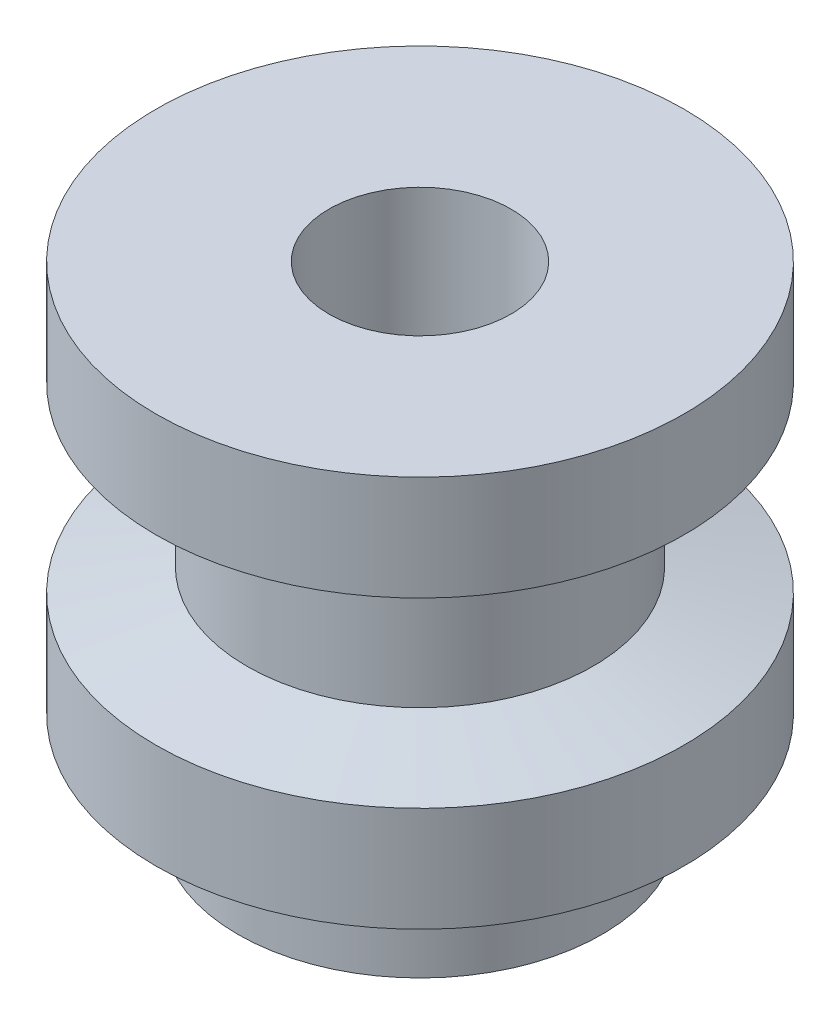
ISO-10303-21;
HEADER;
FILE_DESCRIPTION(('STEP AP214'),'2;1');
FILE_NAME('part.step','',(''),(''),'','','');
FILE_SCHEMA(('AUTOMOTIVE_DESIGN { 1 0 10303 214 1 1 1 1 }'));
ENDSEC;
DATA;
#1=APPLICATION_CONTEXT('core data for automotive mechanical design processes');
#2=APPLICATION_PROTOCOL_DEFINITION('international standard','automotive_design',2000,#1);
#3=PRODUCT_CONTEXT('',#1,'mechanical');
#4=PRODUCT('Part','Part','',(#3));
#5=PRODUCT_RELATED_PRODUCT_CATEGORY('part','',(#4));
#6=PRODUCT_DEFINITION_FORMATION('','',#4);
#7=PRODUCT_DEFINITION_CONTEXT('part definition',#1,'design');
#8=PRODUCT_DEFINITION('design','',#6,#7);
#9=PRODUCT_DEFINITION_SHAPE('','',#8);
#10=(LENGTH_UNIT() NAMED_UNIT(*) SI_UNIT(.MILLI.,.METRE.));
#11=(NAMED_UNIT(*) PLANE_ANGLE_UNIT() SI_UNIT($,.RADIAN.));
#12=(NAMED_UNIT(*) SI_UNIT($,.STERADIAN.) SOLID_ANGLE_UNIT());
#13=UNCERTAINTY_MEASURE_WITH_UNIT(LENGTH_MEASURE(1.E-05),#10,'distance_accuracy_value','');
#14=(GEOMETRIC_REPRESENTATION_CONTEXT(3) GLOBAL_UNCERTAINTY_ASSIGNED_CONTEXT((#13)) GLOBAL_UNIT_ASSIGNED_CONTEXT((#10,
#11,#12)) REPRESENTATION_CONTEXT('',''));
#15=CARTESIAN_POINT('',(0.,0.,0.));
#16=DIRECTION('',(0.,0.,1.));
#17=DIRECTION('',(1.,0.,0.));
#18=AXIS2_PLACEMENT_3D('',#15,#16,#17);
#19=CARTESIAN_POINT('',(0.,0.,-2.));
#20=DIRECTION('',(0.,1.,0.));
#21=DIRECTION('',(0.,0.,-1.));
#22=AXIS2_PLACEMENT_3D('',#19,#20,#21);
#23=PLANE('',#22);
#24=CARTESIAN_POINT('',(0.,0.,0.));
#25=DIRECTION('',(0.,1.,0.));
#26=DIRECTION('',(0.,0.,1.));
#27=AXIS2_PLACEMENT_3D('',#24,#25,#26);
#28=CIRCLE('',#27,1.);
#29=CARTESIAN_POINT('',(0.,0.,1.));
#30=VERTEX_POINT('',#29);
#31=EDGE_CURVE('E10',#30,#30,#28,.T.);
#32=ORIENTED_EDGE('',*,*,#31,.T.);
#33=EDGE_LOOP('',(#32));
#34=FACE_BOUND('',#33,.T.);
#35=CARTESIAN_POINT('',(0.,0.,0.));
#36=DIRECTION('',(0.,1.,0.));
#37=DIRECTION('',(0.,0.,1.));
#38=AXIS2_PLACEMENT_3D('',#35,#36,#37);
#39=CIRCLE('',#38,2.);
#40=CARTESIAN_POINT('',(0.,0.,2.));
#41=VERTEX_POINT('',#40);
#42=EDGE_CURVE('E67',#41,#41,#39,.T.);
#43=ORIENTED_EDGE('',*,*,#42,.F.);
#44=EDGE_LOOP('',(#43));
#45=FACE_BOUND('',#44,.T.);
#46=ADVANCED_FACE('F33',(#34,#45),#23,.F.);
#47=CARTESIAN_POINT('',(0.,0.,0.));
#48=DIRECTION('',(0.,-1.,0.));
#49=DIRECTION('',(0.,0.,1.));
#50=AXIS2_PLACEMENT_3D('',#47,#48,#49);
#51=CYLINDRICAL_SURFACE('',#50,1.);
#52=CARTESIAN_POINT('',(0.,5.4,0.));
#53=DIRECTION('',(0.,1.,0.));
#54=DIRECTION('',(0.,0.,1.));
#55=AXIS2_PLACEMENT_3D('',#52,#53,#54);
#56=CIRCLE('',#55,1.);
#57=CARTESIAN_POINT('',(0.,5.4,1.));
#58=VERTEX_POINT('',#57);
#59=EDGE_CURVE('E39',#58,#58,#56,.T.);
#60=ORIENTED_EDGE('',*,*,#59,.T.);
#61=EDGE_LOOP('',(#60));
#62=FACE_BOUND('',#61,.T.);
#63=ORIENTED_EDGE('',*,*,#31,.F.);
#64=EDGE_LOOP('',(#63));
#65=FACE_BOUND('',#64,.T.);
#66=ADVANCED_FACE('F75',(#62,#65),#51,.F.);
#67=CARTESIAN_POINT('',(0.,5.4,-1.));
#68=DIRECTION('',(0.,-1.,0.));
#69=DIRECTION('',(0.,0.,1.));
#70=AXIS2_PLACEMENT_3D('',#67,#68,#69);
#71=PLANE('',#70);
#72=CARTESIAN_POINT('',(0.,5.4,0.));
#73=DIRECTION('',(0.,1.,0.));
#74=DIRECTION('',(0.,0.,1.));
#75=AXIS2_PLACEMENT_3D('',#72,#73,#74);
#76=CIRCLE('',#75,2.9);
#77=CARTESIAN_POINT('',(0.,5.4,2.9));
#78=VERTEX_POINT('',#77);
#79=EDGE_CURVE('E43',#78,#78,#76,.T.);
#80=ORIENTED_EDGE('',*,*,#79,.T.);
#81=EDGE_LOOP('',(#80));
#82=FACE_BOUND('',#81,.T.);
#83=ORIENTED_EDGE('',*,*,#59,.F.);
#84=EDGE_LOOP('',(#83));
#85=FACE_BOUND('',#84,.T.);
#86=ADVANCED_FACE('F79',(#82,#85),#71,.F.);
#87=CARTESIAN_POINT('',(0.,0.,0.));
#88=DIRECTION('',(0.,-1.,0.));
#89=DIRECTION('',(0.,0.,1.));
#90=AXIS2_PLACEMENT_3D('',#87,#88,#89);
#91=CYLINDRICAL_SURFACE('',#90,2.9);
#92=CARTESIAN_POINT('',(0.,4.25,0.));
#93=DIRECTION('',(0.,1.,0.));
#94=DIRECTION('',(0.,0.,1.));
#95=AXIS2_PLACEMENT_3D('',#92,#93,#94);
#96=CIRCLE('',#95,2.9);
#97=CARTESIAN_POINT('',(0.,4.25,2.9));
#98=VERTEX_POINT('',#97);
#99=EDGE_CURVE('E47',#98,#98,#96,.T.);
#100=ORIENTED_EDGE('',*,*,#99,.T.);
#101=EDGE_LOOP('',(#100));
#102=FACE_BOUND('',#101,.T.);
#103=ORIENTED_EDGE('',*,*,#79,.F.);
#104=EDGE_LOOP('',(#103));
#105=FACE_BOUND('',#104,.T.);
#106=ADVANCED_FACE('F83',(#102,#105),#91,.T.);
#107=CARTESIAN_POINT('',(0.,4.25,0.));
#108=DIRECTION('',(0.,1.,0.));
#109=DIRECTION('',(0.,0.,-1.));
#110=AXIS2_PLACEMENT_3D('',#107,#108,#109);
#111=CONICAL_SURFACE('',#110,2.9,1.32581766366803);
#112=CARTESIAN_POINT('',(0.,4.,0.));
#113=DIRECTION('',(0.,1.,0.));
#114=DIRECTION('',(0.,0.,1.));
#115=AXIS2_PLACEMENT_3D('',#112,#113,#114);
#116=CIRCLE('',#115,1.9);
#117=CARTESIAN_POINT('',(0.,4.,1.9));
#118=VERTEX_POINT('',#117);
#119=EDGE_CURVE('E52',#118,#118,#116,.T.);
#120=ORIENTED_EDGE('',*,*,#119,.T.);
#121=EDGE_LOOP('',(#120));
#122=FACE_BOUND('',#121,.T.);
#123=ORIENTED_EDGE('',*,*,#99,.F.);
#124=EDGE_LOOP('',(#123));
#125=FACE_BOUND('',#124,.T.);
#126=ADVANCED_FACE('F90',(#122,#125),#111,.T.);
#127=CARTESIAN_POINT('',(0.,0.,0.));
#128=DIRECTION('',(0.,-1.,0.));
#129=DIRECTION('',(0.,0.,1.));
#130=AXIS2_PLACEMENT_3D('',#127,#128,#129);
#131=CYLINDRICAL_SURFACE('',#130,1.9);
#132=CARTESIAN_POINT('',(0.,2.5,0.));
#133=DIRECTION('',(0.,1.,0.));
#134=DIRECTION('',(0.,0.,1.));
#135=AXIS2_PLACEMENT_3D('',#132,#133,#134);
#136=CIRCLE('',#135,1.9);
#137=CARTESIAN_POINT('',(0.,2.5,1.9));
#138=VERTEX_POINT('',#137);
#139=EDGE_CURVE('E55',#138,#138,#136,.T.);
#140=ORIENTED_EDGE('',*,*,#139,.T.);
#141=EDGE_LOOP('',(#140));
#142=FACE_BOUND('',#141,.T.);
#143=ORIENTED_EDGE('',*,*,#119,.F.);
#144=EDGE_LOOP('',(#143));
#145=FACE_BOUND('',#144,.T.);
#146=ADVANCED_FACE('F94',(#142,#145),#131,.T.);
#147=CARTESIAN_POINT('',(0.,2.5,0.));
#148=DIRECTION('',(0.,-1.,0.));
#149=DIRECTION('',(0.,0.,1.));
#150=AXIS2_PLACEMENT_3D('',#147,#148,#149);
#151=CONICAL_SURFACE('',#150,1.9,1.32581766366803);
#152=CARTESIAN_POINT('',(0.,2.25,0.));
#153=DIRECTION('',(0.,1.,0.));
#154=DIRECTION('',(0.,0.,1.));
#155=AXIS2_PLACEMENT_3D('',#152,#153,#154);
#156=CIRCLE('',#155,2.9);
#157=CARTESIAN_POINT('',(0.,2.25,2.9));
#158=VERTEX_POINT('',#157);
#159=EDGE_CURVE('E58',#158,#158,#156,.T.);
#160=ORIENTED_EDGE('',*,*,#159,.T.);
#161=EDGE_LOOP('',(#160));
#162=FACE_BOUND('',#161,.T.);
#163=ORIENTED_EDGE('',*,*,#139,.F.);
#164=EDGE_LOOP('',(#163));
#165=FACE_BOUND('',#164,.T.);
#166=ADVANCED_FACE('F98',(#162,#165),#151,.T.);
#167=CARTESIAN_POINT('',(0.,0.,0.));
#168=DIRECTION('',(0.,-1.,0.));
#169=DIRECTION('',(0.,0.,1.));
#170=AXIS2_PLACEMENT_3D('',#167,#168,#169);
#171=CYLINDRICAL_SURFACE('',#170,2.9);
#172=CARTESIAN_POINT('',(0.,1.1,0.));
#173=DIRECTION('',(0.,1.,0.));
#174=DIRECTION('',(0.,0.,1.));
#175=AXIS2_PLACEMENT_3D('',#172,#173,#174);
#176=CIRCLE('',#175,2.9);
#177=CARTESIAN_POINT('',(0.,1.1,2.9));
#178=VERTEX_POINT('',#177);
#179=EDGE_CURVE('E61',#178,#178,#176,.T.);
#180=ORIENTED_EDGE('',*,*,#179,.T.);
#181=EDGE_LOOP('',(#180));
#182=FACE_BOUND('',#181,.T.);
#183=ORIENTED_EDGE('',*,*,#159,.F.);
#184=EDGE_LOOP('',(#183));
#185=FACE_BOUND('',#184,.T.);
#186=ADVANCED_FACE('F102',(#182,#185),#171,.T.);
#187=CARTESIAN_POINT('',(0.,1.1,-2.9));
#188=DIRECTION('',(0.,1.,0.));
#189=DIRECTION('',(0.,0.,-1.));
#190=AXIS2_PLACEMENT_3D('',#187,#188,#189);
#191=PLANE('',#190);
#192=CARTESIAN_POINT('',(0.,1.1,0.));
#193=DIRECTION('',(0.,1.,0.));
#194=DIRECTION('',(0.,0.,1.));
#195=AXIS2_PLACEMENT_3D('',#192,#193,#194);
#196=CIRCLE('',#195,2.);
#197=CARTESIAN_POINT('',(0.,1.1,2.));
#198=VERTEX_POINT('',#197);
#199=EDGE_CURVE('E64',#198,#198,#196,.T.);
#200=ORIENTED_EDGE('',*,*,#199,.T.);
#201=EDGE_LOOP('',(#200));
#202=FACE_BOUND('',#201,.T.);
#203=ORIENTED_EDGE('',*,*,#179,.F.);
#204=EDGE_LOOP('',(#203));
#205=FACE_BOUND('',#204,.T.);
#206=ADVANCED_FACE('F106',(#202,#205),#191,.F.);
#207=CARTESIAN_POINT('',(0.,0.,0.));
#208=DIRECTION('',(0.,-1.,0.));
#209=DIRECTION('',(0.,0.,1.));
#210=AXIS2_PLACEMENT_3D('',#207,#208,#209);
#211=CYLINDRICAL_SURFACE('',#210,2.);
#212=ORIENTED_EDGE('',*,*,#42,.T.);
#213=EDGE_LOOP('',(#212));
#214=FACE_BOUND('',#213,.T.);
#215=ORIENTED_EDGE('',*,*,#199,.F.);
#216=EDGE_LOOP('',(#215));
#217=FACE_BOUND('',#216,.T.);
#218=ADVANCED_FACE('F71',(#214,#217),#211,.T.);
#219=CLOSED_SHELL('',(#46,#66,#86,#106,#126,#146,#166,#186,#206,#218));
#220=MANIFOLD_SOLID_BREP('B2',#219);
#221=ADVANCED_BREP_SHAPE_REPRESENTATION('',(#18,#220),#14);
#222=SHAPE_DEFINITION_REPRESENTATION(#9,#221);
ENDSEC;
END-ISO-10303-21;
